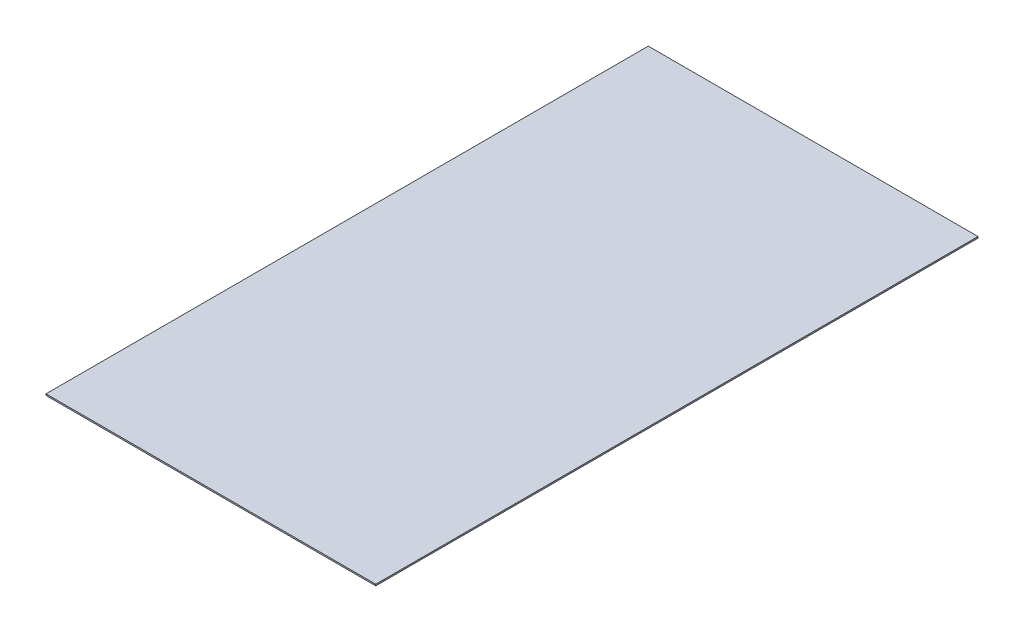
ISO-10303-21;
HEADER;
FILE_DESCRIPTION(('STEP AP214'),'2;1');
FILE_NAME('part.step','',(''),(''),'','','');
FILE_SCHEMA(('AUTOMOTIVE_DESIGN { 1 0 10303 214 1 1 1 1 }'));
ENDSEC;
DATA;
#1=APPLICATION_CONTEXT('core data for automotive mechanical design processes');
#2=APPLICATION_PROTOCOL_DEFINITION('international standard','automotive_design',2000,#1);
#3=PRODUCT_CONTEXT('',#1,'mechanical');
#4=PRODUCT('Part','Part','',(#3));
#5=PRODUCT_RELATED_PRODUCT_CATEGORY('part','',(#4));
#6=PRODUCT_DEFINITION_FORMATION('','',#4);
#7=PRODUCT_DEFINITION_CONTEXT('part definition',#1,'design');
#8=PRODUCT_DEFINITION('design','',#6,#7);
#9=PRODUCT_DEFINITION_SHAPE('','',#8);
#10=(LENGTH_UNIT() NAMED_UNIT(*) SI_UNIT(.MILLI.,.METRE.));
#11=(NAMED_UNIT(*) PLANE_ANGLE_UNIT() SI_UNIT($,.RADIAN.));
#12=(NAMED_UNIT(*) SI_UNIT($,.STERADIAN.) SOLID_ANGLE_UNIT());
#13=UNCERTAINTY_MEASURE_WITH_UNIT(LENGTH_MEASURE(1.E-05),#10,'distance_accuracy_value','');
#14=(GEOMETRIC_REPRESENTATION_CONTEXT(3) GLOBAL_UNCERTAINTY_ASSIGNED_CONTEXT((#13)) GLOBAL_UNIT_ASSIGNED_CONTEXT((#10,
#11,#12)) REPRESENTATION_CONTEXT('',''));
#15=CARTESIAN_POINT('',(0.,0.,0.));
#16=DIRECTION('',(0.,0.,1.));
#17=DIRECTION('',(1.,0.,0.));
#18=AXIS2_PLACEMENT_3D('',#15,#16,#17);
#19=CARTESIAN_POINT('',(2184.4,19.05,3943.35));
#20=DIRECTION('',(-1.,0.,0.));
#21=DIRECTION('',(0.,0.,1.));
#22=AXIS2_PLACEMENT_3D('',#19,#20,#21);
#23=PLANE('',#22);
#24=DIRECTION('',(0.,0.,-1.));
#25=VECTOR('',#24,1.);
#26=CARTESIAN_POINT('',(2184.4,0.,3943.35));
#27=LINE('',#26,#25);
#28=CARTESIAN_POINT('',(2184.4,0.,3943.35));
#29=VERTEX_POINT('',#28);
#30=CARTESIAN_POINT('',(2184.4,0.,-3943.35));
#31=VERTEX_POINT('',#30);
#32=EDGE_CURVE('E95',#29,#31,#27,.T.);
#33=ORIENTED_EDGE('',*,*,#32,.T.);
#34=DIRECTION('',(0.,-1.,0.));
#35=VECTOR('',#34,1.);
#36=CARTESIAN_POINT('',(2184.4,19.05,-3943.35));
#37=LINE('',#36,#35);
#38=CARTESIAN_POINT('',(2184.4,19.05,-3943.35));
#39=VERTEX_POINT('',#38);
#40=EDGE_CURVE('E11',#39,#31,#37,.T.);
#41=ORIENTED_EDGE('',*,*,#40,.F.);
#42=DIRECTION('',(0.,0.,-1.));
#43=VECTOR('',#42,1.);
#44=CARTESIAN_POINT('',(2184.4,19.05,3943.35));
#45=LINE('',#44,#43);
#46=CARTESIAN_POINT('',(2184.4,19.05,3943.35));
#47=VERTEX_POINT('',#46);
#48=EDGE_CURVE('E83',#47,#39,#45,.T.);
#49=ORIENTED_EDGE('',*,*,#48,.F.);
#50=DIRECTION('',(0.,-1.,0.));
#51=VECTOR('',#50,1.);
#52=CARTESIAN_POINT('',(2184.4,19.05,3943.35));
#53=LINE('',#52,#51);
#54=EDGE_CURVE('E91',#47,#29,#53,.T.);
#55=ORIENTED_EDGE('',*,*,#54,.T.);
#56=EDGE_LOOP('',(#33,#41,#49,#55));
#57=FACE_BOUND('',#56,.T.);
#58=ADVANCED_FACE('F32',(#57),#23,.F.);
#59=CARTESIAN_POINT('',(-2133.6,19.05,-3943.35));
#60=DIRECTION('',(0.,0.,1.));
#61=DIRECTION('',(1.,0.,0.));
#62=AXIS2_PLACEMENT_3D('',#59,#60,#61);
#63=PLANE('',#62);
#64=DIRECTION('',(-1.,0.,0.));
#65=VECTOR('',#64,1.);
#66=CARTESIAN_POINT('',(-2133.6,0.,-3943.35));
#67=LINE('',#66,#65);
#68=CARTESIAN_POINT('',(-2133.6,0.,-3943.35));
#69=VERTEX_POINT('',#68);
#70=EDGE_CURVE('E87',#31,#69,#67,.T.);
#71=ORIENTED_EDGE('',*,*,#70,.T.);
#72=DIRECTION('',(0.,-1.,0.));
#73=VECTOR('',#72,1.);
#74=CARTESIAN_POINT('',(-2133.6,19.05,-3943.35));
#75=LINE('',#74,#73);
#76=CARTESIAN_POINT('',(-2133.6,19.05,-3943.35));
#77=VERTEX_POINT('',#76);
#78=EDGE_CURVE('E40',#77,#69,#75,.T.);
#79=ORIENTED_EDGE('',*,*,#78,.F.);
#80=DIRECTION('',(-1.,0.,0.));
#81=VECTOR('',#80,1.);
#82=CARTESIAN_POINT('',(-2133.6,19.05,-3943.35));
#83=LINE('',#82,#81);
#84=EDGE_CURVE('E78',#39,#77,#83,.T.);
#85=ORIENTED_EDGE('',*,*,#84,.F.);
#86=ORIENTED_EDGE('',*,*,#40,.T.);
#87=EDGE_LOOP('',(#71,#79,#85,#86));
#88=FACE_BOUND('',#87,.T.);
#89=ADVANCED_FACE('F86',(#88),#63,.F.);
#90=CARTESIAN_POINT('',(-2133.6,19.05,-3943.35));
#91=DIRECTION('',(1.,0.,0.));
#92=DIRECTION('',(0.,0.,-1.));
#93=AXIS2_PLACEMENT_3D('',#90,#91,#92);
#94=PLANE('',#93);
#95=DIRECTION('',(0.,0.,1.));
#96=VECTOR('',#95,1.);
#97=CARTESIAN_POINT('',(-2133.6,0.,-3943.35));
#98=LINE('',#97,#96);
#99=CARTESIAN_POINT('',(-2133.6,0.,3943.35));
#100=VERTEX_POINT('',#99);
#101=EDGE_CURVE('E65',#69,#100,#98,.T.);
#102=ORIENTED_EDGE('',*,*,#101,.T.);
#103=DIRECTION('',(0.,-1.,0.));
#104=VECTOR('',#103,1.);
#105=CARTESIAN_POINT('',(-2133.6,19.05,3943.35));
#106=LINE('',#105,#104);
#107=CARTESIAN_POINT('',(-2133.6,19.05,3943.35));
#108=VERTEX_POINT('',#107);
#109=EDGE_CURVE('E88',#108,#100,#106,.T.);
#110=ORIENTED_EDGE('',*,*,#109,.F.);
#111=DIRECTION('',(0.,0.,1.));
#112=VECTOR('',#111,1.);
#113=CARTESIAN_POINT('',(-2133.6,19.05,-3943.35));
#114=LINE('',#113,#112);
#115=EDGE_CURVE('E81',#77,#108,#114,.T.);
#116=ORIENTED_EDGE('',*,*,#115,.F.);
#117=ORIENTED_EDGE('',*,*,#78,.T.);
#118=EDGE_LOOP('',(#102,#110,#116,#117));
#119=FACE_BOUND('',#118,.T.);
#120=ADVANCED_FACE('F89',(#119),#94,.F.);
#121=CARTESIAN_POINT('',(-2133.6,19.05,3943.35));
#122=DIRECTION('',(0.,0.,-1.));
#123=DIRECTION('',(-1.,0.,0.));
#124=AXIS2_PLACEMENT_3D('',#121,#122,#123);
#125=PLANE('',#124);
#126=DIRECTION('',(1.,0.,0.));
#127=VECTOR('',#126,1.);
#128=CARTESIAN_POINT('',(-2133.6,0.,3943.35));
#129=LINE('',#128,#127);
#130=EDGE_CURVE('E71',#100,#29,#129,.T.);
#131=ORIENTED_EDGE('',*,*,#130,.T.);
#132=ORIENTED_EDGE('',*,*,#54,.F.);
#133=DIRECTION('',(1.,0.,0.));
#134=VECTOR('',#133,1.);
#135=CARTESIAN_POINT('',(-2133.6,19.05,3943.35));
#136=LINE('',#135,#134);
#137=EDGE_CURVE('E48',#108,#47,#136,.T.);
#138=ORIENTED_EDGE('',*,*,#137,.F.);
#139=ORIENTED_EDGE('',*,*,#109,.T.);
#140=EDGE_LOOP('',(#131,#132,#138,#139));
#141=FACE_BOUND('',#140,.T.);
#142=ADVANCED_FACE('F102',(#141),#125,.F.);
#143=CARTESIAN_POINT('',(0.,19.05,0.));
#144=DIRECTION('',(0.,-1.,0.));
#145=DIRECTION('',(0.,0.,-1.));
#146=AXIS2_PLACEMENT_3D('',#143,#144,#145);
#147=PLANE('',#146);
#148=ORIENTED_EDGE('',*,*,#48,.T.);
#149=ORIENTED_EDGE('',*,*,#84,.T.);
#150=ORIENTED_EDGE('',*,*,#115,.T.);
#151=ORIENTED_EDGE('',*,*,#137,.T.);
#152=EDGE_LOOP('',(#148,#149,#150,#151));
#153=FACE_BOUND('',#152,.T.);
#154=ADVANCED_FACE('F79',(#153),#147,.F.);
#155=CARTESIAN_POINT('',(0.,0.,0.));
#156=DIRECTION('',(0.,-1.,0.));
#157=DIRECTION('',(0.,0.,-1.));
#158=AXIS2_PLACEMENT_3D('',#155,#156,#157);
#159=PLANE('',#158);
#160=ORIENTED_EDGE('',*,*,#32,.F.);
#161=ORIENTED_EDGE('',*,*,#130,.F.);
#162=ORIENTED_EDGE('',*,*,#101,.F.);
#163=ORIENTED_EDGE('',*,*,#70,.F.);
#164=EDGE_LOOP('',(#160,#161,#162,#163));
#165=FACE_BOUND('',#164,.T.);
#166=ADVANCED_FACE('F105',(#165),#159,.T.);
#167=CLOSED_SHELL('',(#58,#89,#120,#142,#154,#166));
#168=MANIFOLD_SOLID_BREP('B2',#167);
#169=ADVANCED_BREP_SHAPE_REPRESENTATION('',(#18,#168),#14);
#170=SHAPE_DEFINITION_REPRESENTATION(#9,#169);
ENDSEC;
END-ISO-10303-21;
